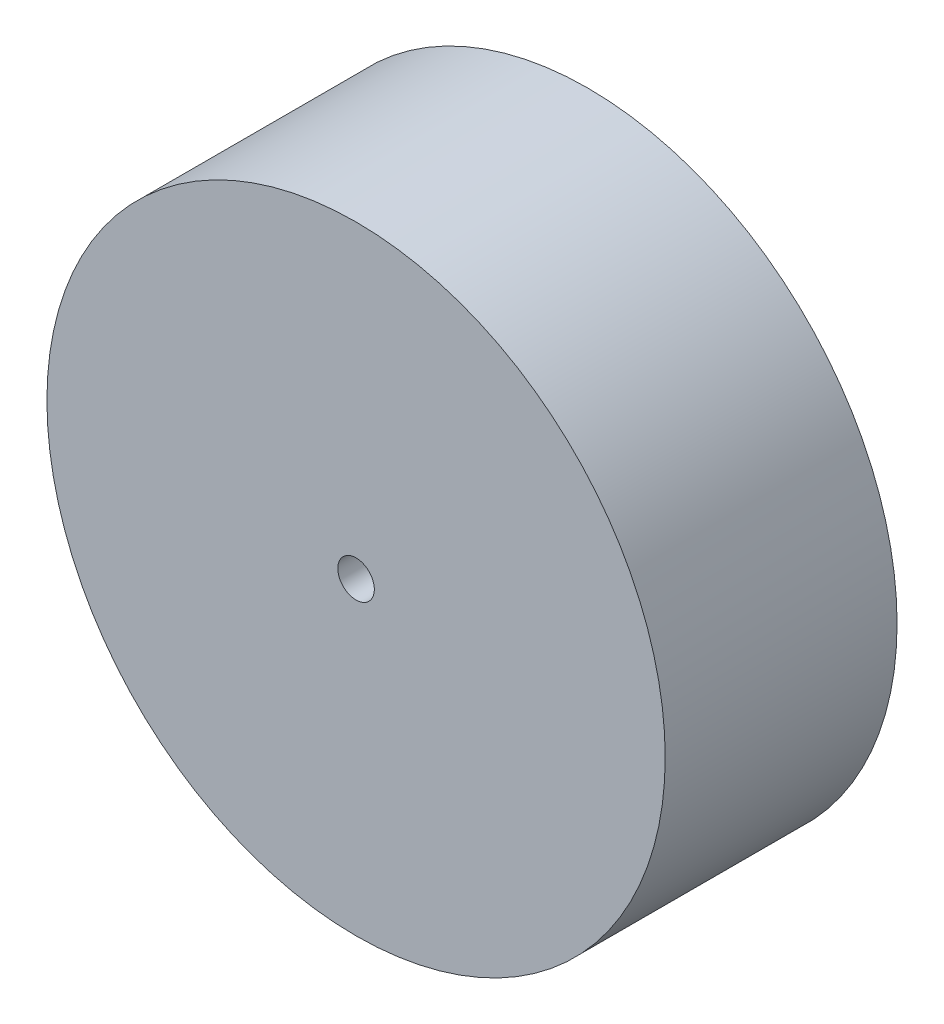
ISO-10303-21;
HEADER;
FILE_DESCRIPTION(('STEP AP214'),'2;1');
FILE_NAME('part.step','',(''),(''),'','','');
FILE_SCHEMA(('AUTOMOTIVE_DESIGN { 1 0 10303 214 1 1 1 1 }'));
ENDSEC;
DATA;
#1=APPLICATION_CONTEXT('core data for automotive mechanical design processes');
#2=APPLICATION_PROTOCOL_DEFINITION('international standard','automotive_design',2000,#1);
#3=PRODUCT_CONTEXT('',#1,'mechanical');
#4=PRODUCT('Part','Part','',(#3));
#5=PRODUCT_RELATED_PRODUCT_CATEGORY('part','',(#4));
#6=PRODUCT_DEFINITION_FORMATION('','',#4);
#7=PRODUCT_DEFINITION_CONTEXT('part definition',#1,'design');
#8=PRODUCT_DEFINITION('design','',#6,#7);
#9=PRODUCT_DEFINITION_SHAPE('','',#8);
#10=(LENGTH_UNIT() NAMED_UNIT(*) SI_UNIT(.MILLI.,.METRE.));
#11=(NAMED_UNIT(*) PLANE_ANGLE_UNIT() SI_UNIT($,.RADIAN.));
#12=(NAMED_UNIT(*) SI_UNIT($,.STERADIAN.) SOLID_ANGLE_UNIT());
#13=UNCERTAINTY_MEASURE_WITH_UNIT(LENGTH_MEASURE(1.E-05),#10,'distance_accuracy_value','');
#14=(GEOMETRIC_REPRESENTATION_CONTEXT(3) GLOBAL_UNCERTAINTY_ASSIGNED_CONTEXT((#13)) GLOBAL_UNIT_ASSIGNED_CONTEXT((#10,
#11,#12)) REPRESENTATION_CONTEXT('',''));
#15=CARTESIAN_POINT('',(0.,0.,0.));
#16=DIRECTION('',(0.,0.,1.));
#17=DIRECTION('',(1.,0.,0.));
#18=AXIS2_PLACEMENT_3D('',#15,#16,#17);
#19=CARTESIAN_POINT('',(0.,0.,19.05));
#20=DIRECTION('',(0.,0.,-1.));
#21=DIRECTION('',(-1.,0.,0.));
#22=AXIS2_PLACEMENT_3D('',#19,#20,#21);
#23=CYLINDRICAL_SURFACE('',#22,25.4);
#24=CARTESIAN_POINT('',(0.,0.,19.05));
#25=DIRECTION('',(0.,0.,1.));
#26=DIRECTION('',(1.,0.,0.));
#27=AXIS2_PLACEMENT_3D('',#24,#25,#26);
#28=CIRCLE('',#27,25.4);
#29=CARTESIAN_POINT('',(-25.4,0.,19.05));
#30=VERTEX_POINT('',#29);
#31=EDGE_CURVE('E10',#30,#30,#28,.T.);
#32=CARTESIAN_POINT('',(0.,0.,0.));
#33=DIRECTION('',(0.,0.,1.));
#34=DIRECTION('',(1.,0.,0.));
#35=AXIS2_PLACEMENT_3D('',#32,#33,#34);
#36=CIRCLE('',#35,25.4);
#37=CARTESIAN_POINT('',(-25.4,0.,0.));
#38=VERTEX_POINT('',#37);
#39=EDGE_CURVE('E44',#38,#38,#36,.T.);
#40=CARTESIAN_POINT('',(-25.4,0.,19.05));
#41=CARTESIAN_POINT('',(-25.4,0.,18.8515625));
#42=CARTESIAN_POINT('',(-25.4,0.,18.653125));
#43=CARTESIAN_POINT('',(-25.4,0.,18.25625));
#44=CARTESIAN_POINT('',(-25.4,0.,18.0578125));
#45=CARTESIAN_POINT('',(-25.4,0.,17.6609375));
#46=CARTESIAN_POINT('',(-25.4,0.,17.4625));
#47=CARTESIAN_POINT('',(-25.4,0.,17.065625));
#48=CARTESIAN_POINT('',(-25.4,0.,16.8671875));
#49=CARTESIAN_POINT('',(-25.4,0.,16.4703125));
#50=CARTESIAN_POINT('',(-25.4,0.,16.271875));
#51=CARTESIAN_POINT('',(-25.4,0.,15.875));
#52=CARTESIAN_POINT('',(-25.4,0.,15.6765625));
#53=CARTESIAN_POINT('',(-25.4,0.,15.2796875));
#54=CARTESIAN_POINT('',(-25.4,0.,15.08125));
#55=CARTESIAN_POINT('',(-25.4,0.,14.684375));
#56=CARTESIAN_POINT('',(-25.4,0.,14.4859375));
#57=CARTESIAN_POINT('',(-25.4,0.,14.0890625));
#58=CARTESIAN_POINT('',(-25.4,0.,13.890625));
#59=CARTESIAN_POINT('',(-25.4,0.,13.49375));
#60=CARTESIAN_POINT('',(-25.4,0.,13.2953125));
#61=CARTESIAN_POINT('',(-25.4,0.,12.8984375));
#62=CARTESIAN_POINT('',(-25.4,0.,12.7));
#63=CARTESIAN_POINT('',(-25.4,0.,12.303125));
#64=CARTESIAN_POINT('',(-25.4,0.,12.1046875));
#65=CARTESIAN_POINT('',(-25.4,0.,11.7078125));
#66=CARTESIAN_POINT('',(-25.4,0.,11.509375));
#67=CARTESIAN_POINT('',(-25.4,0.,11.1125));
#68=CARTESIAN_POINT('',(-25.4,0.,10.9140625));
#69=CARTESIAN_POINT('',(-25.4,0.,10.5171875));
#70=CARTESIAN_POINT('',(-25.4,0.,10.31875));
#71=CARTESIAN_POINT('',(-25.4,0.,9.921875));
#72=CARTESIAN_POINT('',(-25.4,0.,9.7234375));
#73=CARTESIAN_POINT('',(-25.4,0.,9.3265625));
#74=CARTESIAN_POINT('',(-25.4,0.,9.128125));
#75=CARTESIAN_POINT('',(-25.4,0.,8.73125));
#76=CARTESIAN_POINT('',(-25.4,0.,8.5328125));
#77=CARTESIAN_POINT('',(-25.4,0.,8.1359375));
#78=CARTESIAN_POINT('',(-25.4,0.,7.9375));
#79=CARTESIAN_POINT('',(-25.4,0.,7.540625));
#80=CARTESIAN_POINT('',(-25.4,0.,7.3421875));
#81=CARTESIAN_POINT('',(-25.4,0.,6.9453125));
#82=CARTESIAN_POINT('',(-25.4,0.,6.746875));
#83=CARTESIAN_POINT('',(-25.4,0.,6.35));
#84=CARTESIAN_POINT('',(-25.4,0.,6.1515625));
#85=CARTESIAN_POINT('',(-25.4,0.,5.7546875));
#86=CARTESIAN_POINT('',(-25.4,0.,5.55625));
#87=CARTESIAN_POINT('',(-25.4,0.,5.159375));
#88=CARTESIAN_POINT('',(-25.4,0.,4.9609375));
#89=CARTESIAN_POINT('',(-25.4,0.,4.5640625));
#90=CARTESIAN_POINT('',(-25.4,0.,4.365625));
#91=CARTESIAN_POINT('',(-25.4,0.,3.96875));
#92=CARTESIAN_POINT('',(-25.4,0.,3.7703125));
#93=CARTESIAN_POINT('',(-25.4,0.,3.3734375));
#94=CARTESIAN_POINT('',(-25.4,0.,3.175));
#95=CARTESIAN_POINT('',(-25.4,0.,2.778125));
#96=CARTESIAN_POINT('',(-25.4,0.,2.5796875));
#97=CARTESIAN_POINT('',(-25.4,0.,2.1828125));
#98=CARTESIAN_POINT('',(-25.4,0.,1.984375));
#99=CARTESIAN_POINT('',(-25.4,0.,1.5875));
#100=CARTESIAN_POINT('',(-25.4,0.,1.3890625));
#101=CARTESIAN_POINT('',(-25.4,0.,0.992187500000001));
#102=CARTESIAN_POINT('',(-25.4,0.,0.793750000000001));
#103=CARTESIAN_POINT('',(-25.4,0.,0.396875));
#104=CARTESIAN_POINT('',(-25.4,0.,0.1984375));
#105=CARTESIAN_POINT('',(-25.4,0.,0.));
#106=B_SPLINE_CURVE_WITH_KNOTS('',3,(#40,#41,#42,#43,#44,#45,#46,#47,#48,#49,#50,#51,#52,#53,
#54,#55,#56,#57,#58,#59,#60,#61,#62,#63,#64,#65,#66,#67,#68,#69,#70,#71,#72,#73,#74,#75,#76,#77,
#78,#79,#80,#81,#82,#83,#84,#85,#86,#87,#88,#89,#90,#91,#92,#93,#94,#95,#96,#97,#98,#99,#100,
#101,#102,#103,#104,#105),.UNSPECIFIED.,.F.,.F.,(4,2,2,2,2,2,2,2,2,2,2,2,2,2,2,2,2,2,2,2,2,2,2,
2,2,2,2,2,2,2,2,2,4),(0.,0.5953125,1.190625,1.7859375,2.38125,2.9765625,3.571875,4.1671875,
4.7625,5.3578125,5.953125,6.5484375,7.14375,7.7390625,8.334375,8.9296875,9.525,10.1203125,
10.715625,11.3109375,11.90625,12.5015625,13.096875,13.6921875,14.2875,14.8828125,15.478125,
16.0734375,16.66875,17.2640625,17.859375,18.4546875,19.05),.UNSPECIFIED.);
#107=EDGE_CURVE('BSEAM41',#30,#38,#106,.T.);
#108=ORIENTED_EDGE('',*,*,#31,.F.);
#109=ORIENTED_EDGE('',*,*,#39,.T.);
#110=ORIENTED_EDGE('',*,*,#107,.T.);
#111=ORIENTED_EDGE('',*,*,#107,.F.);
#112=EDGE_LOOP('',(#108,#110,#109,#111));
#113=FACE_BOUND('',#112,.T.);
#114=ADVANCED_FACE('F41',(#113),#23,.T.);
#115=CARTESIAN_POINT('',(0.,0.,19.05));
#116=DIRECTION('',(0.,0.,1.));
#117=DIRECTION('',(1.,0.,0.));
#118=AXIS2_PLACEMENT_3D('',#115,#116,#117);
#119=PLANE('',#118);
#120=CARTESIAN_POINT('',(0.,0.,19.05));
#121=DIRECTION('',(0.,0.,-1.));
#122=DIRECTION('',(-1.,0.,0.));
#123=AXIS2_PLACEMENT_3D('',#120,#121,#122);
#124=CIRCLE('',#123,1.5);
#125=CARTESIAN_POINT('',(-1.5,0.,19.05));
#126=VERTEX_POINT('',#125);
#127=EDGE_CURVE('E53',#126,#126,#124,.T.);
#128=ORIENTED_EDGE('',*,*,#127,.T.);
#129=EDGE_LOOP('',(#128));
#130=FACE_BOUND('',#129,.T.);
#131=ORIENTED_EDGE('',*,*,#31,.T.);
#132=EDGE_LOOP('',(#131));
#133=FACE_BOUND('',#132,.T.);
#134=ADVANCED_FACE('F63',(#130,#133),#119,.T.);
#135=CARTESIAN_POINT('',(0.,0.,0.));
#136=DIRECTION('',(0.,0.,1.));
#137=DIRECTION('',(1.,0.,0.));
#138=AXIS2_PLACEMENT_3D('',#135,#136,#137);
#139=PLANE('',#138);
#140=CARTESIAN_POINT('',(0.,0.,0.));
#141=DIRECTION('',(0.,0.,-1.));
#142=DIRECTION('',(-1.,0.,0.));
#143=AXIS2_PLACEMENT_3D('',#140,#141,#142);
#144=CIRCLE('',#143,1.5);
#145=CARTESIAN_POINT('',(-1.5,0.,0.));
#146=VERTEX_POINT('',#145);
#147=EDGE_CURVE('E55',#146,#146,#144,.T.);
#148=ORIENTED_EDGE('',*,*,#147,.F.);
#149=EDGE_LOOP('',(#148));
#150=FACE_BOUND('',#149,.T.);
#151=ORIENTED_EDGE('',*,*,#39,.F.);
#152=EDGE_LOOP('',(#151));
#153=FACE_BOUND('',#152,.T.);
#154=ADVANCED_FACE('F68',(#150,#153),#139,.F.);
#155=CARTESIAN_POINT('',(0.,0.,19.05));
#156=DIRECTION('',(0.,0.,-1.));
#157=DIRECTION('',(-1.,0.,0.));
#158=AXIS2_PLACEMENT_3D('',#155,#156,#157);
#159=CYLINDRICAL_SURFACE('',#158,1.5);
#160=CARTESIAN_POINT('',(-1.5,0.,19.05));
#161=CARTESIAN_POINT('',(-1.5,0.,18.8515625));
#162=CARTESIAN_POINT('',(-1.5,0.,18.653125));
#163=CARTESIAN_POINT('',(-1.5,0.,18.25625));
#164=CARTESIAN_POINT('',(-1.5,0.,18.0578125));
#165=CARTESIAN_POINT('',(-1.5,0.,17.6609375));
#166=CARTESIAN_POINT('',(-1.5,0.,17.4625));
#167=CARTESIAN_POINT('',(-1.5,0.,17.065625));
#168=CARTESIAN_POINT('',(-1.5,0.,16.8671875));
#169=CARTESIAN_POINT('',(-1.5,0.,16.4703125));
#170=CARTESIAN_POINT('',(-1.5,0.,16.271875));
#171=CARTESIAN_POINT('',(-1.5,0.,15.875));
#172=CARTESIAN_POINT('',(-1.5,0.,15.6765625));
#173=CARTESIAN_POINT('',(-1.5,0.,15.2796875));
#174=CARTESIAN_POINT('',(-1.5,0.,15.08125));
#175=CARTESIAN_POINT('',(-1.5,0.,14.684375));
#176=CARTESIAN_POINT('',(-1.5,0.,14.4859375));
#177=CARTESIAN_POINT('',(-1.5,0.,14.0890625));
#178=CARTESIAN_POINT('',(-1.5,0.,13.890625));
#179=CARTESIAN_POINT('',(-1.5,0.,13.49375));
#180=CARTESIAN_POINT('',(-1.5,0.,13.2953125));
#181=CARTESIAN_POINT('',(-1.5,0.,12.8984375));
#182=CARTESIAN_POINT('',(-1.5,0.,12.7));
#183=CARTESIAN_POINT('',(-1.5,0.,12.303125));
#184=CARTESIAN_POINT('',(-1.5,0.,12.1046875));
#185=CARTESIAN_POINT('',(-1.5,0.,11.7078125));
#186=CARTESIAN_POINT('',(-1.5,0.,11.509375));
#187=CARTESIAN_POINT('',(-1.5,0.,11.1125));
#188=CARTESIAN_POINT('',(-1.5,0.,10.9140625));
#189=CARTESIAN_POINT('',(-1.5,0.,10.5171875));
#190=CARTESIAN_POINT('',(-1.5,0.,10.31875));
#191=CARTESIAN_POINT('',(-1.5,0.,9.921875));
#192=CARTESIAN_POINT('',(-1.5,0.,9.7234375));
#193=CARTESIAN_POINT('',(-1.5,0.,9.3265625));
#194=CARTESIAN_POINT('',(-1.5,0.,9.128125));
#195=CARTESIAN_POINT('',(-1.5,0.,8.73125));
#196=CARTESIAN_POINT('',(-1.5,0.,8.5328125));
#197=CARTESIAN_POINT('',(-1.5,0.,8.1359375));
#198=CARTESIAN_POINT('',(-1.5,0.,7.9375));
#199=CARTESIAN_POINT('',(-1.5,0.,7.540625));
#200=CARTESIAN_POINT('',(-1.5,0.,7.3421875));
#201=CARTESIAN_POINT('',(-1.5,0.,6.9453125));
#202=CARTESIAN_POINT('',(-1.5,0.,6.746875));
#203=CARTESIAN_POINT('',(-1.5,0.,6.35));
#204=CARTESIAN_POINT('',(-1.5,0.,6.1515625));
#205=CARTESIAN_POINT('',(-1.5,0.,5.7546875));
#206=CARTESIAN_POINT('',(-1.5,0.,5.55625));
#207=CARTESIAN_POINT('',(-1.5,0.,5.159375));
#208=CARTESIAN_POINT('',(-1.5,0.,4.9609375));
#209=CARTESIAN_POINT('',(-1.5,0.,4.5640625));
#210=CARTESIAN_POINT('',(-1.5,0.,4.365625));
#211=CARTESIAN_POINT('',(-1.5,0.,3.96875));
#212=CARTESIAN_POINT('',(-1.5,0.,3.7703125));
#213=CARTESIAN_POINT('',(-1.5,0.,3.3734375));
#214=CARTESIAN_POINT('',(-1.5,0.,3.175));
#215=CARTESIAN_POINT('',(-1.5,0.,2.778125));
#216=CARTESIAN_POINT('',(-1.5,0.,2.5796875));
#217=CARTESIAN_POINT('',(-1.5,0.,2.1828125));
#218=CARTESIAN_POINT('',(-1.5,0.,1.984375));
#219=CARTESIAN_POINT('',(-1.5,0.,1.5875));
#220=CARTESIAN_POINT('',(-1.5,0.,1.3890625));
#221=CARTESIAN_POINT('',(-1.5,0.,0.992187500000001));
#222=CARTESIAN_POINT('',(-1.5,0.,0.793750000000001));
#223=CARTESIAN_POINT('',(-1.5,0.,0.396875));
#224=CARTESIAN_POINT('',(-1.5,0.,0.1984375));
#225=CARTESIAN_POINT('',(-1.5,0.,0.));
#226=B_SPLINE_CURVE_WITH_KNOTS('',3,(#160,#161,#162,#163,#164,#165,#166,#167,#168,#169,#170,
#171,#172,#173,#174,#175,#176,#177,#178,#179,#180,#181,#182,#183,#184,#185,#186,#187,#188,#189,
#190,#191,#192,#193,#194,#195,#196,#197,#198,#199,#200,#201,#202,#203,#204,#205,#206,#207,#208,
#209,#210,#211,#212,#213,#214,#215,#216,#217,#218,#219,#220,#221,#222,#223,#224,#225),
.UNSPECIFIED.,.F.,.F.,(4,2,2,2,2,2,2,2,2,2,2,2,2,2,2,2,2,2,2,2,2,2,2,2,2,2,2,2,2,2,2,2,4),(0.,
0.5953125,1.190625,1.7859375,2.38125,2.9765625,3.571875,4.1671875,4.7625,5.3578125,5.953125,
6.5484375,7.14375,7.7390625,8.334375,8.9296875,9.525,10.1203125,10.715625,11.3109375,11.90625,
12.5015625,13.096875,13.6921875,14.2875,14.8828125,15.478125,16.0734375,16.66875,17.2640625,
17.859375,18.4546875,19.05),.UNSPECIFIED.);
#227=EDGE_CURVE('BSEAM65',#126,#146,#226,.T.);
#228=ORIENTED_EDGE('',*,*,#127,.F.);
#229=ORIENTED_EDGE('',*,*,#147,.T.);
#230=ORIENTED_EDGE('',*,*,#227,.T.);
#231=ORIENTED_EDGE('',*,*,#227,.F.);
#232=EDGE_LOOP('',(#228,#230,#229,#231));
#233=FACE_BOUND('',#232,.T.);
#234=ADVANCED_FACE('F65',(#233),#159,.F.);
#235=CLOSED_SHELL('',(#114,#134,#154,#234));
#236=MANIFOLD_SOLID_BREP('B2',#235);
#237=ADVANCED_BREP_SHAPE_REPRESENTATION('',(#18,#236),#14);
#238=SHAPE_DEFINITION_REPRESENTATION(#9,#237);
ENDSEC;
END-ISO-10303-21;
